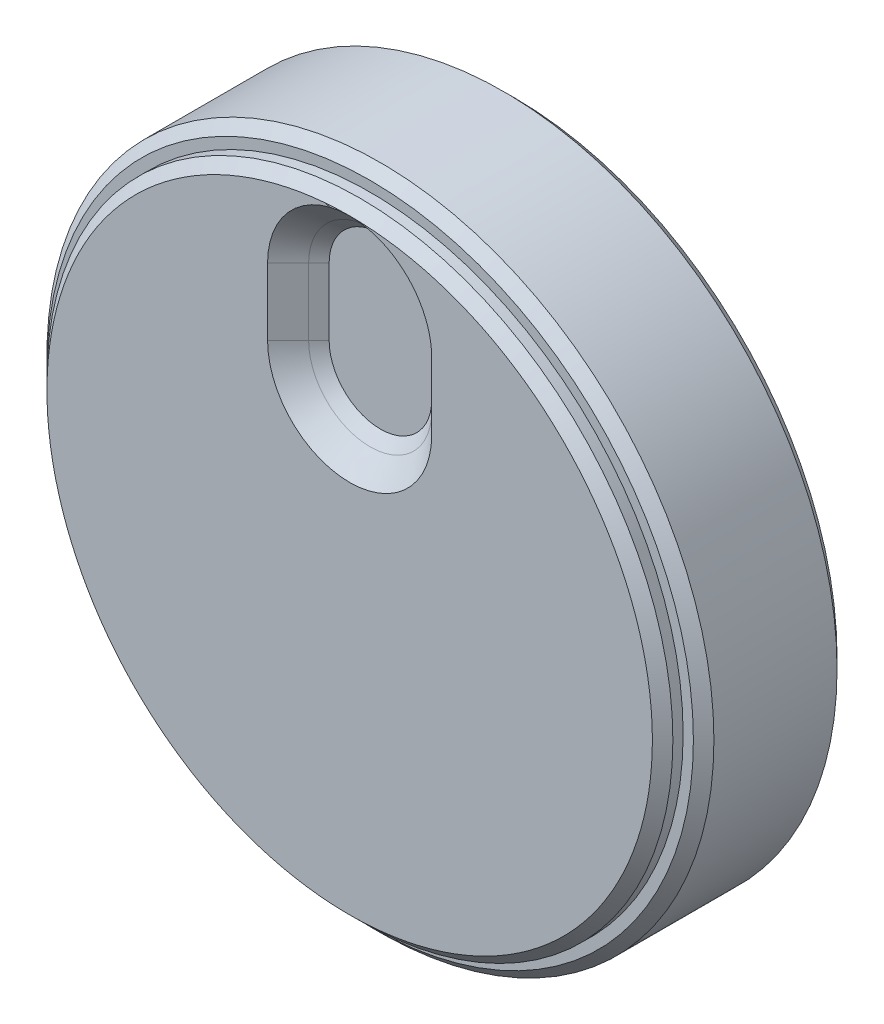
ISO-10303-21;
HEADER;
FILE_DESCRIPTION(('STEP AP214'),'2;1');
FILE_NAME('part.step','',(''),(''),'','','');
FILE_SCHEMA(('AUTOMOTIVE_DESIGN { 1 0 10303 214 1 1 1 1 }'));
ENDSEC;
DATA;
#1=APPLICATION_CONTEXT('core data for automotive mechanical design processes');
#2=APPLICATION_PROTOCOL_DEFINITION('international standard','automotive_design',2000,#1);
#3=PRODUCT_CONTEXT('',#1,'mechanical');
#4=PRODUCT('Part','Part','',(#3));
#5=PRODUCT_RELATED_PRODUCT_CATEGORY('part','',(#4));
#6=PRODUCT_DEFINITION_FORMATION('','',#4);
#7=PRODUCT_DEFINITION_CONTEXT('part definition',#1,'design');
#8=PRODUCT_DEFINITION('design','',#6,#7);
#9=PRODUCT_DEFINITION_SHAPE('','',#8);
#10=(LENGTH_UNIT() NAMED_UNIT(*) SI_UNIT(.MILLI.,.METRE.));
#11=(NAMED_UNIT(*) PLANE_ANGLE_UNIT() SI_UNIT($,.RADIAN.));
#12=(NAMED_UNIT(*) SI_UNIT($,.STERADIAN.) SOLID_ANGLE_UNIT());
#13=UNCERTAINTY_MEASURE_WITH_UNIT(LENGTH_MEASURE(1.E-05),#10,'distance_accuracy_value','');
#14=(GEOMETRIC_REPRESENTATION_CONTEXT(3) GLOBAL_UNCERTAINTY_ASSIGNED_CONTEXT((#13)) GLOBAL_UNIT_ASSIGNED_CONTEXT((#10,
#11,#12)) REPRESENTATION_CONTEXT('',''));
#15=CARTESIAN_POINT('',(0.,0.,0.));
#16=DIRECTION('',(0.,0.,1.));
#17=DIRECTION('',(1.,0.,0.));
#18=AXIS2_PLACEMENT_3D('',#15,#16,#17);
#19=CARTESIAN_POINT('',(0.,0.,14.));
#20=DIRECTION('',(0.,0.,-1.));
#21=DIRECTION('',(-1.,0.,0.));
#22=AXIS2_PLACEMENT_3D('',#19,#20,#21);
#23=CYLINDRICAL_SURFACE('',#22,3.);
#24=CARTESIAN_POINT('',(0.,0.,14.));
#25=DIRECTION('',(0.,0.,1.));
#26=DIRECTION('',(1.,0.,0.));
#27=AXIS2_PLACEMENT_3D('',#24,#25,#26);
#28=CIRCLE('',#27,3.);
#29=CARTESIAN_POINT('',(3.,0.,14.));
#30=VERTEX_POINT('',#29);
#31=EDGE_CURVE('E133',#30,#30,#28,.T.);
#32=ORIENTED_EDGE('',*,*,#31,.T.);
#33=EDGE_LOOP('',(#32));
#34=FACE_BOUND('',#33,.T.);
#35=CARTESIAN_POINT('',(0.,0.,3.));
#36=DIRECTION('',(0.,0.,-1.));
#37=DIRECTION('',(-1.,0.,0.));
#38=AXIS2_PLACEMENT_3D('',#35,#36,#37);
#39=CIRCLE('',#38,3.);
#40=CARTESIAN_POINT('',(-3.,0.,3.));
#41=VERTEX_POINT('',#40);
#42=EDGE_CURVE('E193',#41,#41,#39,.T.);
#43=ORIENTED_EDGE('',*,*,#42,.T.);
#44=EDGE_LOOP('',(#43));
#45=FACE_BOUND('',#44,.T.);
#46=ADVANCED_FACE('F41',(#34,#45),#23,.F.);
#47=CARTESIAN_POINT('',(0.,0.,14.));
#48=DIRECTION('',(0.,0.,1.));
#49=DIRECTION('',(1.,0.,0.));
#50=AXIS2_PLACEMENT_3D('',#47,#48,#49);
#51=PLANE('',#50);
#52=CARTESIAN_POINT('',(0.,0.,14.));
#53=DIRECTION('',(0.,0.,1.));
#54=DIRECTION('',(1.,0.,0.));
#55=AXIS2_PLACEMENT_3D('',#52,#53,#54);
#56=CIRCLE('',#55,31.5);
#57=CARTESIAN_POINT('',(31.5,0.,14.));
#58=VERTEX_POINT('',#57);
#59=EDGE_CURVE('E176',#58,#58,#56,.T.);
#60=ORIENTED_EDGE('',*,*,#59,.T.);
#61=EDGE_LOOP('',(#60));
#62=FACE_BOUND('',#61,.T.);
#63=CARTESIAN_POINT('',(0.,0.,14.));
#64=DIRECTION('',(0.,0.,1.));
#65=DIRECTION('',(1.,0.,0.));
#66=AXIS2_PLACEMENT_3D('',#63,#64,#65);
#67=CIRCLE('',#66,30.5);
#68=CARTESIAN_POINT('',(30.5,0.,14.));
#69=VERTEX_POINT('',#68);
#70=EDGE_CURVE('E192',#69,#69,#67,.T.);
#71=ORIENTED_EDGE('',*,*,#70,.F.);
#72=EDGE_LOOP('',(#71));
#73=FACE_BOUND('',#72,.T.);
#74=ADVANCED_FACE('F218',(#62,#73),#51,.T.);
#75=CARTESIAN_POINT('',(0.,0.,0.));
#76=DIRECTION('',(0.,0.,1.));
#77=DIRECTION('',(1.,0.,0.));
#78=AXIS2_PLACEMENT_3D('',#75,#76,#77);
#79=PLANE('',#78);
#80=CARTESIAN_POINT('',(0.,0.,0.));
#81=DIRECTION('',(0.,0.,1.));
#82=DIRECTION('',(1.,0.,0.));
#83=AXIS2_PLACEMENT_3D('',#80,#81,#82);
#84=CIRCLE('',#83,31.5);
#85=CARTESIAN_POINT('',(31.5,0.,0.));
#86=VERTEX_POINT('',#85);
#87=EDGE_CURVE('E180',#86,#86,#84,.F.);
#88=ORIENTED_EDGE('',*,*,#87,.T.);
#89=EDGE_LOOP('',(#88));
#90=FACE_BOUND('',#89,.T.);
#91=CARTESIAN_POINT('',(0.,0.,0.));
#92=DIRECTION('',(0.,0.,-1.));
#93=DIRECTION('',(-1.,0.,0.));
#94=AXIS2_PLACEMENT_3D('',#91,#92,#93);
#95=CIRCLE('',#94,17.5);
#96=CARTESIAN_POINT('',(-17.5,0.,0.));
#97=VERTEX_POINT('',#96);
#98=EDGE_CURVE('E201',#97,#97,#95,.T.);
#99=ORIENTED_EDGE('',*,*,#98,.F.);
#100=EDGE_LOOP('',(#99));
#101=FACE_BOUND('',#100,.T.);
#102=ADVANCED_FACE('F220',(#90,#101),#79,.F.);
#103=CARTESIAN_POINT('',(0.,0.,14.));
#104=DIRECTION('',(0.,0.,-1.));
#105=DIRECTION('',(-1.,0.,0.));
#106=AXIS2_PLACEMENT_3D('',#103,#104,#105);
#107=CYLINDRICAL_SURFACE('',#106,32.5);
#108=CARTESIAN_POINT('',(0.,0.,0.999999999999994));
#109=DIRECTION('',(0.,0.,1.));
#110=DIRECTION('',(1.,0.,0.));
#111=AXIS2_PLACEMENT_3D('',#108,#109,#110);
#112=CIRCLE('',#111,32.5);
#113=CARTESIAN_POINT('',(32.5,0.,0.999999999999994));
#114=VERTEX_POINT('',#113);
#115=EDGE_CURVE('E184',#114,#114,#112,.T.);
#116=ORIENTED_EDGE('',*,*,#115,.T.);
#117=EDGE_LOOP('',(#116));
#118=FACE_BOUND('',#117,.T.);
#119=CARTESIAN_POINT('',(0.,0.,13.));
#120=DIRECTION('',(0.,0.,1.));
#121=DIRECTION('',(1.,0.,0.));
#122=AXIS2_PLACEMENT_3D('',#119,#120,#121);
#123=CIRCLE('',#122,32.5);
#124=CARTESIAN_POINT('',(32.5,0.,13.));
#125=VERTEX_POINT('',#124);
#126=EDGE_CURVE('E188',#125,#125,#123,.F.);
#127=ORIENTED_EDGE('',*,*,#126,.T.);
#128=EDGE_LOOP('',(#127));
#129=FACE_BOUND('',#128,.T.);
#130=ADVANCED_FACE('F227',(#118,#129),#107,.T.);
#131=CARTESIAN_POINT('',(0.,0.,3.));
#132=DIRECTION('',(0.,0.,-1.));
#133=DIRECTION('',(-1.,0.,0.));
#134=AXIS2_PLACEMENT_3D('',#131,#132,#133);
#135=CYLINDRICAL_SURFACE('',#134,17.5);
#136=CARTESIAN_POINT('',(0.,0.,3.));
#137=DIRECTION('',(0.,0.,-1.));
#138=DIRECTION('',(-1.,0.,0.));
#139=AXIS2_PLACEMENT_3D('',#136,#137,#138);
#140=CIRCLE('',#139,17.5);
#141=CARTESIAN_POINT('',(-17.5,0.,3.));
#142=VERTEX_POINT('',#141);
#143=EDGE_CURVE('E197',#142,#142,#140,.T.);
#144=ORIENTED_EDGE('',*,*,#143,.F.);
#145=EDGE_LOOP('',(#144));
#146=FACE_BOUND('',#145,.T.);
#147=ORIENTED_EDGE('',*,*,#98,.T.);
#148=EDGE_LOOP('',(#147));
#149=FACE_BOUND('',#148,.T.);
#150=ADVANCED_FACE('F236',(#146,#149),#135,.F.);
#151=CARTESIAN_POINT('',(0.,0.,3.));
#152=DIRECTION('',(0.,0.,-1.));
#153=DIRECTION('',(-1.,0.,0.));
#154=AXIS2_PLACEMENT_3D('',#151,#152,#153);
#155=PLANE('',#154);
#156=ORIENTED_EDGE('',*,*,#42,.F.);
#157=EDGE_LOOP('',(#156));
#158=FACE_BOUND('',#157,.T.);
#159=ORIENTED_EDGE('',*,*,#143,.T.);
#160=EDGE_LOOP('',(#159));
#161=FACE_BOUND('',#160,.T.);
#162=ADVANCED_FACE('F322',(#158,#161),#155,.T.);
#163=CARTESIAN_POINT('',(0.,0.,16.));
#164=DIRECTION('',(0.,0.,1.));
#165=DIRECTION('',(1.,0.,0.));
#166=AXIS2_PLACEMENT_3D('',#163,#164,#165);
#167=PLANE('',#166);
#168=CARTESIAN_POINT('',(0.,0.,16.));
#169=DIRECTION('',(0.,0.,1.));
#170=DIRECTION('',(1.,0.,0.));
#171=AXIS2_PLACEMENT_3D('',#168,#169,#170);
#172=CIRCLE('',#171,29.5);
#173=CARTESIAN_POINT('',(0.,29.5,16.));
#174=VERTEX_POINT('',#173);
#175=EDGE_CURVE('E172',#174,#174,#172,.T.);
#176=ORIENTED_EDGE('',*,*,#175,.T.);
#177=CARTESIAN_POINT('',(0.,21.5,16.));
#178=DIRECTION('',(0.,0.,1.));
#179=DIRECTION('',(1.,0.,0.));
#180=AXIS2_PLACEMENT_3D('',#177,#178,#179);
#181=CIRCLE('',#180,8.);
#182=CARTESIAN_POINT('',(8.,21.5,16.));
#183=VERTEX_POINT('',#182);
#184=EDGE_CURVE('E149',#174,#183,#181,.F.);
#185=ORIENTED_EDGE('',*,*,#184,.T.);
#186=DIRECTION('',(0.,-1.,0.));
#187=VECTOR('',#186,1.);
#188=CARTESIAN_POINT('',(8.00000000000001,15.,16.));
#189=LINE('',#188,#187);
#190=CARTESIAN_POINT('',(8.,15.,16.));
#191=VERTEX_POINT('',#190);
#192=EDGE_CURVE('E152',#183,#191,#189,.T.);
#193=ORIENTED_EDGE('',*,*,#192,.T.);
#194=CARTESIAN_POINT('',(0.,15.,16.));
#195=DIRECTION('',(0.,0.,1.));
#196=DIRECTION('',(1.,0.,0.));
#197=AXIS2_PLACEMENT_3D('',#194,#195,#196);
#198=CIRCLE('',#197,8.);
#199=CARTESIAN_POINT('',(-8.,15.,16.));
#200=VERTEX_POINT('',#199);
#201=EDGE_CURVE('E159',#191,#200,#198,.F.);
#202=ORIENTED_EDGE('',*,*,#201,.T.);
#203=DIRECTION('',(0.,1.,0.));
#204=VECTOR('',#203,1.);
#205=CARTESIAN_POINT('',(-8.,21.5,16.));
#206=LINE('',#205,#204);
#207=CARTESIAN_POINT('',(-8.,21.5,16.));
#208=VERTEX_POINT('',#207);
#209=EDGE_CURVE('E162',#200,#208,#206,.T.);
#210=ORIENTED_EDGE('',*,*,#209,.T.);
#211=CARTESIAN_POINT('',(0.,21.5,16.));
#212=DIRECTION('',(0.,0.,1.));
#213=DIRECTION('',(1.,0.,0.));
#214=AXIS2_PLACEMENT_3D('',#211,#212,#213);
#215=CIRCLE('',#214,8.);
#216=EDGE_CURVE('E156',#208,#174,#215,.F.);
#217=ORIENTED_EDGE('',*,*,#216,.T.);
#218=EDGE_LOOP('',(#176,#185,#193,#202,#210,#217));
#219=FACE_BOUND('',#218,.T.);
#220=ADVANCED_FACE('F318',(#219),#167,.T.);
#221=CARTESIAN_POINT('',(0.,0.,16.));
#222=DIRECTION('',(0.,0.,-1.));
#223=DIRECTION('',(-1.,0.,0.));
#224=AXIS2_PLACEMENT_3D('',#221,#222,#223);
#225=CYLINDRICAL_SURFACE('',#224,30.5);
#226=CARTESIAN_POINT('',(0.,0.,15.));
#227=DIRECTION('',(0.,0.,1.));
#228=DIRECTION('',(1.,0.,0.));
#229=AXIS2_PLACEMENT_3D('',#226,#227,#228);
#230=CIRCLE('',#229,30.5);
#231=CARTESIAN_POINT('',(30.5,0.,15.));
#232=VERTEX_POINT('',#231);
#233=EDGE_CURVE('E168',#232,#232,#230,.F.);
#234=ORIENTED_EDGE('',*,*,#233,.T.);
#235=EDGE_LOOP('',(#234));
#236=FACE_BOUND('',#235,.T.);
#237=ORIENTED_EDGE('',*,*,#70,.T.);
#238=EDGE_LOOP('',(#237));
#239=FACE_BOUND('',#238,.T.);
#240=ADVANCED_FACE('F216',(#236,#239),#225,.T.);
#241=CARTESIAN_POINT('',(0.,0.,14.));
#242=DIRECTION('',(0.,0.,1.));
#243=DIRECTION('',(1.,0.,0.));
#244=AXIS2_PLACEMENT_3D('',#241,#242,#243);
#245=PLANE('',#244);
#246=ORIENTED_EDGE('',*,*,#31,.F.);
#247=EDGE_LOOP('',(#246));
#248=FACE_BOUND('',#247,.T.);
#249=ADVANCED_FACE('F246',(#248),#245,.F.);
#250=CARTESIAN_POINT('',(0.,0.,0.999999999999994));
#251=DIRECTION('',(0.,0.,1.));
#252=DIRECTION('',(1.,0.,0.));
#253=AXIS2_PLACEMENT_3D('',#250,#251,#252);
#254=CONICAL_SURFACE('',#253,32.5,0.785398163397455);
#255=ORIENTED_EDGE('',*,*,#87,.F.);
#256=EDGE_LOOP('',(#255));
#257=FACE_BOUND('',#256,.T.);
#258=ORIENTED_EDGE('',*,*,#115,.F.);
#259=EDGE_LOOP('',(#258));
#260=FACE_BOUND('',#259,.T.);
#261=ADVANCED_FACE('F239',(#257,#260),#254,.T.);
#262=CARTESIAN_POINT('',(0.,0.,14.));
#263=DIRECTION('',(0.,0.,-1.));
#264=DIRECTION('',(-1.,0.,0.));
#265=AXIS2_PLACEMENT_3D('',#262,#263,#264);
#266=CONICAL_SURFACE('',#265,31.5,0.785398163397438);
#267=ORIENTED_EDGE('',*,*,#126,.F.);
#268=EDGE_LOOP('',(#267));
#269=FACE_BOUND('',#268,.T.);
#270=ORIENTED_EDGE('',*,*,#59,.F.);
#271=EDGE_LOOP('',(#270));
#272=FACE_BOUND('',#271,.T.);
#273=ADVANCED_FACE('F245',(#269,#272),#266,.T.);
#274=CARTESIAN_POINT('',(0.,0.,16.));
#275=DIRECTION('',(0.,0.,-1.));
#276=DIRECTION('',(-1.,0.,0.));
#277=AXIS2_PLACEMENT_3D('',#274,#275,#276);
#278=CONICAL_SURFACE('',#277,29.5,0.78539816339745);
#279=ORIENTED_EDGE('',*,*,#233,.F.);
#280=EDGE_LOOP('',(#279));
#281=FACE_BOUND('',#280,.T.);
#282=ORIENTED_EDGE('',*,*,#175,.F.);
#283=EDGE_LOOP('',(#282));
#284=FACE_BOUND('',#283,.T.);
#285=ADVANCED_FACE('F253',(#281,#284),#278,.T.);
#286=CARTESIAN_POINT('',(-6.,21.5,14.));
#287=DIRECTION('',(0.707106781186545,0.,0.70710678118655));
#288=DIRECTION('',(0.,1.,0.));
#289=AXIS2_PLACEMENT_3D('',#286,#287,#288);
#290=PLANE('',#289);
#291=DIRECTION('',(0.70710678118655,0.,-0.707106781186545));
#292=VECTOR('',#291,1.);
#293=CARTESIAN_POINT('',(-8.,21.5,16.));
#294=LINE('',#293,#292);
#295=CARTESIAN_POINT('',(-6.,21.5,14.));
#296=VERTEX_POINT('',#295);
#297=EDGE_CURVE('E134',#208,#296,#294,.T.);
#298=ORIENTED_EDGE('',*,*,#297,.F.);
#299=ORIENTED_EDGE('',*,*,#209,.F.);
#300=DIRECTION('',(-0.70710678118655,0.,0.707106781186545));
#301=VECTOR('',#300,1.);
#302=CARTESIAN_POINT('',(-6.,15.,14.));
#303=LINE('',#302,#301);
#304=CARTESIAN_POINT('',(-6.,15.,14.));
#305=VERTEX_POINT('',#304);
#306=EDGE_CURVE('E129',#305,#200,#303,.T.);
#307=ORIENTED_EDGE('',*,*,#306,.F.);
#308=DIRECTION('',(0.,-1.,0.));
#309=VECTOR('',#308,1.);
#310=CARTESIAN_POINT('',(-6.,15.,14.));
#311=LINE('',#310,#309);
#312=EDGE_CURVE('E11',#296,#305,#311,.T.);
#313=ORIENTED_EDGE('',*,*,#312,.F.);
#314=EDGE_LOOP('',(#298,#299,#307,#313));
#315=FACE_BOUND('',#314,.T.);
#316=ADVANCED_FACE('F260',(#315),#290,.T.);
#317=CARTESIAN_POINT('',(0.,15.,14.));
#318=DIRECTION('',(0.,0.,1.));
#319=DIRECTION('',(1.,0.,0.));
#320=AXIS2_PLACEMENT_3D('',#317,#318,#319);
#321=CONICAL_SURFACE('',#320,6.,0.785398163397452);
#322=ORIENTED_EDGE('',*,*,#306,.T.);
#323=ORIENTED_EDGE('',*,*,#201,.F.);
#324=DIRECTION('',(0.70710678118655,0.,0.707106781186545));
#325=VECTOR('',#324,1.);
#326=CARTESIAN_POINT('',(6.,15.,14.));
#327=LINE('',#326,#325);
#328=CARTESIAN_POINT('',(6.,15.,14.));
#329=VERTEX_POINT('',#328);
#330=EDGE_CURVE('E138',#329,#191,#327,.T.);
#331=ORIENTED_EDGE('',*,*,#330,.F.);
#332=CARTESIAN_POINT('',(0.,15.,14.));
#333=DIRECTION('',(0.,0.,1.));
#334=DIRECTION('',(1.,0.,0.));
#335=AXIS2_PLACEMENT_3D('',#332,#333,#334);
#336=CIRCLE('',#335,6.);
#337=EDGE_CURVE('E52',#305,#329,#336,.T.);
#338=ORIENTED_EDGE('',*,*,#337,.F.);
#339=EDGE_LOOP('',(#322,#323,#331,#338));
#340=FACE_BOUND('',#339,.T.);
#341=ADVANCED_FACE('F276',(#340),#321,.F.);
#342=CARTESIAN_POINT('',(0.,21.5,14.));
#343=DIRECTION('',(0.,0.,1.));
#344=DIRECTION('',(1.,0.,0.));
#345=AXIS2_PLACEMENT_3D('',#342,#343,#344);
#346=CONICAL_SURFACE('',#345,6.,0.785398163397452);
#347=ORIENTED_EDGE('',*,*,#297,.T.);
#348=CARTESIAN_POINT('',(0.,21.5,14.));
#349=DIRECTION('',(0.,0.,1.));
#350=DIRECTION('',(1.,0.,0.));
#351=AXIS2_PLACEMENT_3D('',#348,#349,#350);
#352=CIRCLE('',#351,6.);
#353=CARTESIAN_POINT('',(6.,21.5,14.));
#354=VERTEX_POINT('',#353);
#355=EDGE_CURVE('E120',#354,#296,#352,.T.);
#356=ORIENTED_EDGE('',*,*,#355,.F.);
#357=DIRECTION('',(-0.70710678118655,0.,-0.707106781186545));
#358=VECTOR('',#357,1.);
#359=CARTESIAN_POINT('',(8.,21.5,16.));
#360=LINE('',#359,#358);
#361=EDGE_CURVE('E117',#183,#354,#360,.T.);
#362=ORIENTED_EDGE('',*,*,#361,.F.);
#363=ORIENTED_EDGE('',*,*,#184,.F.);
#364=ORIENTED_EDGE('',*,*,#216,.F.);
#365=EDGE_LOOP('',(#347,#356,#362,#363,#364));
#366=FACE_BOUND('',#365,.T.);
#367=ADVANCED_FACE('F269',(#366),#346,.F.);
#368=CARTESIAN_POINT('',(6.,21.5,14.));
#369=DIRECTION('',(-0.707106781186545,0.,0.70710678118655));
#370=DIRECTION('',(0.,-1.,0.));
#371=AXIS2_PLACEMENT_3D('',#368,#369,#370);
#372=PLANE('',#371);
#373=ORIENTED_EDGE('',*,*,#330,.T.);
#374=ORIENTED_EDGE('',*,*,#192,.F.);
#375=ORIENTED_EDGE('',*,*,#361,.T.);
#376=DIRECTION('',(0.,1.,0.));
#377=VECTOR('',#376,1.);
#378=CARTESIAN_POINT('',(6.,21.5,14.));
#379=LINE('',#378,#377);
#380=EDGE_CURVE('E165',#329,#354,#379,.T.);
#381=ORIENTED_EDGE('',*,*,#380,.F.);
#382=EDGE_LOOP('',(#373,#374,#375,#381));
#383=FACE_BOUND('',#382,.T.);
#384=ADVANCED_FACE('F263',(#383),#372,.T.);
#385=CARTESIAN_POINT('',(0.,21.5,13.));
#386=DIRECTION('',(0.,0.,1.));
#387=DIRECTION('',(1.,0.,0.));
#388=AXIS2_PLACEMENT_3D('',#385,#386,#387);
#389=PLANE('',#388);
#390=CARTESIAN_POINT('',(0.,15.,13.));
#391=DIRECTION('',(0.,0.,1.));
#392=DIRECTION('',(1.,0.,0.));
#393=AXIS2_PLACEMENT_3D('',#390,#391,#392);
#394=CIRCLE('',#393,5.);
#395=CARTESIAN_POINT('',(-5.,15.,13.));
#396=VERTEX_POINT('',#395);
#397=CARTESIAN_POINT('',(5.,15.,13.));
#398=VERTEX_POINT('',#397);
#399=EDGE_CURVE('E60',#396,#398,#394,.T.);
#400=ORIENTED_EDGE('',*,*,#399,.T.);
#401=DIRECTION('',(0.,1.,0.));
#402=VECTOR('',#401,1.);
#403=CARTESIAN_POINT('',(5.,15.,13.));
#404=LINE('',#403,#402);
#405=CARTESIAN_POINT('',(5.,21.5,13.));
#406=VERTEX_POINT('',#405);
#407=EDGE_CURVE('E106',#398,#406,#404,.T.);
#408=ORIENTED_EDGE('',*,*,#407,.T.);
#409=CARTESIAN_POINT('',(0.,21.5,13.));
#410=DIRECTION('',(0.,0.,1.));
#411=DIRECTION('',(1.,0.,0.));
#412=AXIS2_PLACEMENT_3D('',#409,#410,#411);
#413=CIRCLE('',#412,5.);
#414=CARTESIAN_POINT('',(-5.,21.5,13.));
#415=VERTEX_POINT('',#414);
#416=EDGE_CURVE('E101',#406,#415,#413,.T.);
#417=ORIENTED_EDGE('',*,*,#416,.T.);
#418=DIRECTION('',(0.,-1.,0.));
#419=VECTOR('',#418,1.);
#420=CARTESIAN_POINT('',(-5.,21.5,13.));
#421=LINE('',#420,#419);
#422=EDGE_CURVE('E104',#415,#396,#421,.T.);
#423=ORIENTED_EDGE('',*,*,#422,.T.);
#424=EDGE_LOOP('',(#400,#408,#417,#423));
#425=FACE_BOUND('',#424,.T.);
#426=ADVANCED_FACE('F103',(#425),#389,.T.);
#427=CARTESIAN_POINT('',(-5.,21.5,13.));
#428=DIRECTION('',(-0.707106781186543,0.,-0.707106781186552));
#429=DIRECTION('',(0.,-1.,0.));
#430=AXIS2_PLACEMENT_3D('',#427,#428,#429);
#431=PLANE('',#430);
#432=DIRECTION('',(0.707106781186552,0.,-0.707106781186543));
#433=VECTOR('',#432,1.);
#434=CARTESIAN_POINT('',(-6.,21.5,14.));
#435=LINE('',#434,#433);
#436=EDGE_CURVE('E113',#296,#415,#435,.T.);
#437=ORIENTED_EDGE('',*,*,#436,.F.);
#438=ORIENTED_EDGE('',*,*,#312,.T.);
#439=DIRECTION('',(-0.707106781186552,0.,0.707106781186543));
#440=VECTOR('',#439,1.);
#441=CARTESIAN_POINT('',(-5.,15.,13.));
#442=LINE('',#441,#440);
#443=EDGE_CURVE('E46',#396,#305,#442,.T.);
#444=ORIENTED_EDGE('',*,*,#443,.F.);
#445=ORIENTED_EDGE('',*,*,#422,.F.);
#446=EDGE_LOOP('',(#437,#438,#444,#445));
#447=FACE_BOUND('',#446,.T.);
#448=ADVANCED_FACE('F44',(#447),#431,.F.);
#449=CARTESIAN_POINT('',(0.,15.,13.));
#450=DIRECTION('',(0.,0.,1.));
#451=DIRECTION('',(1.,0.,0.));
#452=AXIS2_PLACEMENT_3D('',#449,#450,#451);
#453=CONICAL_SURFACE('',#452,5.,0.785398163397455);
#454=ORIENTED_EDGE('',*,*,#443,.T.);
#455=ORIENTED_EDGE('',*,*,#337,.T.);
#456=DIRECTION('',(0.707106781186552,0.,0.707106781186543));
#457=VECTOR('',#456,1.);
#458=CARTESIAN_POINT('',(5.,15.,13.));
#459=LINE('',#458,#457);
#460=EDGE_CURVE('E122',#398,#329,#459,.T.);
#461=ORIENTED_EDGE('',*,*,#460,.F.);
#462=ORIENTED_EDGE('',*,*,#399,.F.);
#463=EDGE_LOOP('',(#454,#455,#461,#462));
#464=FACE_BOUND('',#463,.T.);
#465=ADVANCED_FACE('F299',(#464),#453,.F.);
#466=CARTESIAN_POINT('',(0.,21.5,13.));
#467=DIRECTION('',(0.,0.,1.));
#468=DIRECTION('',(1.,0.,0.));
#469=AXIS2_PLACEMENT_3D('',#466,#467,#468);
#470=CONICAL_SURFACE('',#469,5.,0.785398163397455);
#471=ORIENTED_EDGE('',*,*,#436,.T.);
#472=ORIENTED_EDGE('',*,*,#416,.F.);
#473=DIRECTION('',(-0.707106781186552,0.,-0.707106781186543));
#474=VECTOR('',#473,1.);
#475=CARTESIAN_POINT('',(6.,21.5,14.));
#476=LINE('',#475,#474);
#477=EDGE_CURVE('E68',#354,#406,#476,.T.);
#478=ORIENTED_EDGE('',*,*,#477,.F.);
#479=ORIENTED_EDGE('',*,*,#355,.T.);
#480=EDGE_LOOP('',(#471,#472,#478,#479));
#481=FACE_BOUND('',#480,.T.);
#482=ADVANCED_FACE('F119',(#481),#470,.F.);
#483=CARTESIAN_POINT('',(5.,15.,13.));
#484=DIRECTION('',(0.707106781186543,0.,-0.707106781186552));
#485=DIRECTION('',(0.,1.,0.));
#486=AXIS2_PLACEMENT_3D('',#483,#484,#485);
#487=PLANE('',#486);
#488=ORIENTED_EDGE('',*,*,#460,.T.);
#489=ORIENTED_EDGE('',*,*,#380,.T.);
#490=ORIENTED_EDGE('',*,*,#477,.T.);
#491=ORIENTED_EDGE('',*,*,#407,.F.);
#492=EDGE_LOOP('',(#488,#489,#490,#491));
#493=FACE_BOUND('',#492,.T.);
#494=ADVANCED_FACE('F289',(#493),#487,.F.);
#495=CLOSED_SHELL('',(#46,#74,#102,#130,#150,#162,#220,#240,#249,#261,#273,#285,#316,#341,#367,
#384,#426,#448,#465,#482,#494));
#496=MANIFOLD_SOLID_BREP('B2',#495);
#497=ADVANCED_BREP_SHAPE_REPRESENTATION('',(#18,#496),#14);
#498=SHAPE_DEFINITION_REPRESENTATION(#9,#497);
ENDSEC;
END-ISO-10303-21;
